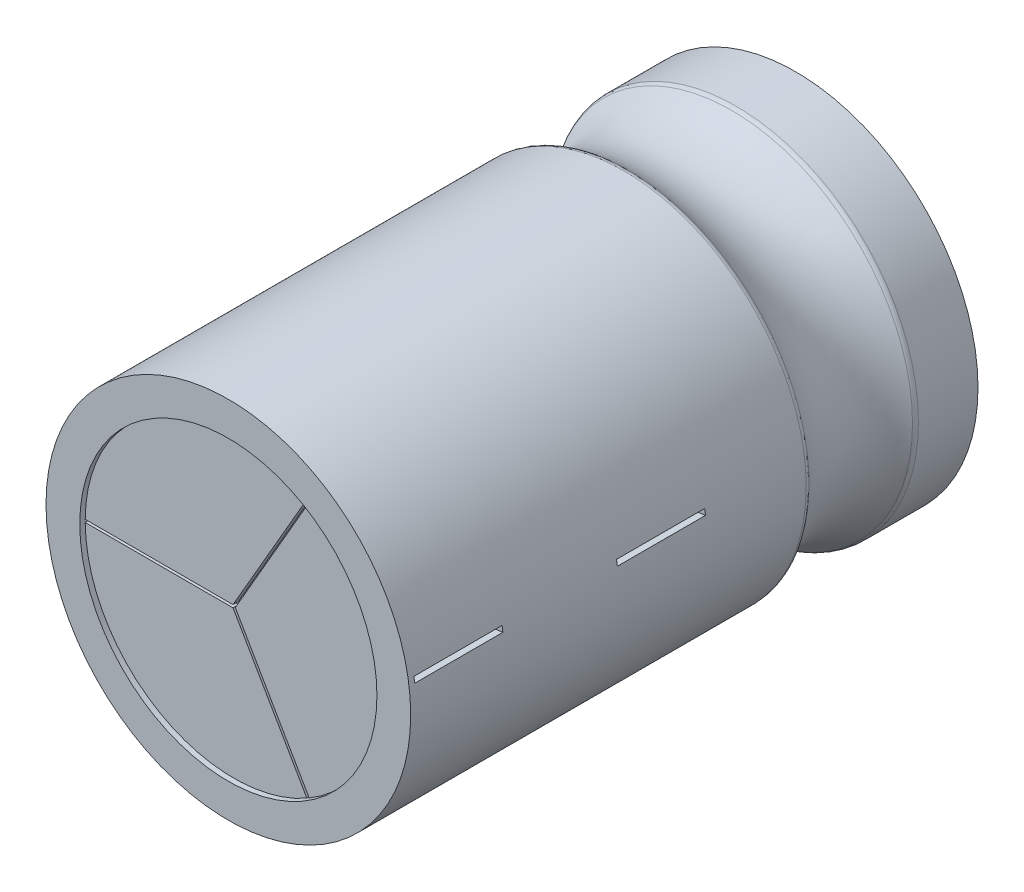
ISO-10303-21;
HEADER;
FILE_DESCRIPTION(('STEP AP214'),'2;1');
FILE_NAME('part.step','',(''),(''),'','','');
FILE_SCHEMA(('AUTOMOTIVE_DESIGN { 1 0 10303 214 1 1 1 1 }'));
ENDSEC;
DATA;
#1=APPLICATION_CONTEXT('core data for automotive mechanical design processes');
#2=APPLICATION_PROTOCOL_DEFINITION('international standard','automotive_design',2000,#1);
#3=PRODUCT_CONTEXT('',#1,'mechanical');
#4=PRODUCT('Part','Part','',(#3));
#5=PRODUCT_RELATED_PRODUCT_CATEGORY('part','',(#4));
#6=PRODUCT_DEFINITION_FORMATION('','',#4);
#7=PRODUCT_DEFINITION_CONTEXT('part definition',#1,'design');
#8=PRODUCT_DEFINITION('design','',#6,#7);
#9=PRODUCT_DEFINITION_SHAPE('','',#8);
#10=(LENGTH_UNIT() NAMED_UNIT(*) SI_UNIT(.MILLI.,.METRE.));
#11=(NAMED_UNIT(*) PLANE_ANGLE_UNIT() SI_UNIT($,.RADIAN.));
#12=(NAMED_UNIT(*) SI_UNIT($,.STERADIAN.) SOLID_ANGLE_UNIT());
#13=UNCERTAINTY_MEASURE_WITH_UNIT(LENGTH_MEASURE(1.E-05),#10,'distance_accuracy_value','');
#14=(GEOMETRIC_REPRESENTATION_CONTEXT(3) GLOBAL_UNCERTAINTY_ASSIGNED_CONTEXT((#13)) GLOBAL_UNIT_ASSIGNED_CONTEXT((#10,
#11,#12)) REPRESENTATION_CONTEXT('',''));
#15=CARTESIAN_POINT('',(0.,0.,0.));
#16=DIRECTION('',(0.,0.,1.));
#17=DIRECTION('',(1.,0.,0.));
#18=AXIS2_PLACEMENT_3D('',#15,#16,#17);
#19=CARTESIAN_POINT('',(0.,0.,0.));
#20=DIRECTION('',(0.,0.,1.));
#21=DIRECTION('',(1.,0.,0.));
#22=AXIS2_PLACEMENT_3D('',#19,#20,#21);
#23=PLANE('',#22);
#24=CARTESIAN_POINT('',(-2.53999999999999,0.,0.));
#25=DIRECTION('',(0.,0.,1.));
#26=DIRECTION('',(1.,0.,0.));
#27=AXIS2_PLACEMENT_3D('',#24,#25,#26);
#28=CIRCLE('',#27,0.6);
#29=CARTESIAN_POINT('',(-1.93999999999999,0.,0.));
#30=VERTEX_POINT('',#29);
#31=EDGE_CURVE('E96',#30,#30,#28,.F.);
#32=ORIENTED_EDGE('',*,*,#31,.F.);
#33=EDGE_LOOP('',(#32));
#34=FACE_BOUND('',#33,.T.);
#35=CARTESIAN_POINT('',(0.,0.,0.));
#36=DIRECTION('',(0.,0.,1.));
#37=DIRECTION('',(1.,0.,0.));
#38=AXIS2_PLACEMENT_3D('',#35,#36,#37);
#39=CIRCLE('',#38,6.75);
#40=CARTESIAN_POINT('',(-6.75,0.,0.));
#41=VERTEX_POINT('',#40);
#42=EDGE_CURVE('E389',#41,#41,#39,.T.);
#43=ORIENTED_EDGE('',*,*,#42,.F.);
#44=EDGE_LOOP('',(#43));
#45=FACE_BOUND('',#44,.T.);
#46=CARTESIAN_POINT('',(2.53999999999999,0.,0.));
#47=DIRECTION('',(0.,0.,1.));
#48=DIRECTION('',(1.,0.,0.));
#49=AXIS2_PLACEMENT_3D('',#46,#47,#48);
#50=CIRCLE('',#49,0.6);
#51=CARTESIAN_POINT('',(3.13999999999999,0.,0.));
#52=VERTEX_POINT('',#51);
#53=EDGE_CURVE('E13',#52,#52,#50,.F.);
#54=ORIENTED_EDGE('',*,*,#53,.F.);
#55=EDGE_LOOP('',(#54));
#56=FACE_BOUND('',#55,.T.);
#57=ADVANCED_FACE('F88',(#34,#45,#56),#23,.F.);
#58=CARTESIAN_POINT('',(0.,0.,20.8));
#59=DIRECTION('',(0.,0.,1.));
#60=DIRECTION('',(1.,0.,0.));
#61=AXIS2_PLACEMENT_3D('',#58,#59,#60);
#62=PLANE('',#61);
#63=DIRECTION('',(-1.,0.,0.));
#64=VECTOR('',#63,1.);
#65=CARTESIAN_POINT('',(0.,0.0499999999999997,20.8));
#66=LINE('',#65,#64);
#67=CARTESIAN_POINT('',(-0.0288675134594828,0.0499999999999997,20.8));
#68=VERTEX_POINT('',#67);
#69=CARTESIAN_POINT('',(-5.49977272257682,0.049999999999999,20.8));
#70=VERTEX_POINT('',#69);
#71=EDGE_CURVE('E336',#68,#70,#66,.T.);
#72=ORIENTED_EDGE('',*,*,#71,.F.);
#73=DIRECTION('',(0.500000000000004,0.866025403784436,0.));
#74=VECTOR('',#73,1.);
#75=CARTESIAN_POINT('',(-5.34399220665468,-9.15606601717793,20.8));
#76=LINE('',#75,#74);
#77=CARTESIAN_POINT('',(2.70658509109921,4.78794289279222,20.8));
#78=VERTEX_POINT('',#77);
#79=EDGE_CURVE('E301',#68,#78,#76,.T.);
#80=ORIENTED_EDGE('',*,*,#79,.T.);
#81=CARTESIAN_POINT('',(0.,0.,20.8));
#82=DIRECTION('',(0.,0.,1.));
#83=DIRECTION('',(1.,0.,0.));
#84=AXIS2_PLACEMENT_3D('',#81,#82,#83);
#85=CIRCLE('',#84,5.5);
#86=EDGE_CURVE('E392',#78,#70,#85,.T.);
#87=ORIENTED_EDGE('',*,*,#86,.T.);
#88=EDGE_LOOP('',(#72,#80,#87));
#89=FACE_BOUND('',#88,.T.);
#90=ADVANCED_FACE('F434',(#89),#62,.T.);
#91=DIRECTION('',(0.499999999999992,-0.866025403784443,0.));
#92=VECTOR('',#91,1.);
#93=CARTESIAN_POINT('',(5.25738966627616,-9.20606601717808,20.8));
#94=LINE('',#93,#92);
#95=CARTESIAN_POINT('',(-0.0288675134594838,-0.049999999999998,20.8));
#96=VERTEX_POINT('',#95);
#97=CARTESIAN_POINT('',(2.70658509109914,-4.78794289279225,20.8));
#98=VERTEX_POINT('',#97);
#99=EDGE_CURVE('E355',#96,#98,#94,.T.);
#100=ORIENTED_EDGE('',*,*,#99,.F.);
#101=DIRECTION('',(-1.,0.,0.));
#102=VECTOR('',#101,1.);
#103=CARTESIAN_POINT('',(0.,-0.0499999999999997,20.8));
#104=LINE('',#103,#102);
#105=CARTESIAN_POINT('',(-5.49977272257682,-0.049999999999999,20.8));
#106=VERTEX_POINT('',#105);
#107=EDGE_CURVE('E346',#96,#106,#104,.T.);
#108=ORIENTED_EDGE('',*,*,#107,.T.);
#109=EDGE_CURVE('E400',#106,#98,#85,.T.);
#110=ORIENTED_EDGE('',*,*,#109,.T.);
#111=EDGE_LOOP('',(#100,#108,#110));
#112=FACE_BOUND('',#111,.T.);
#113=ADVANCED_FACE('F462',(#112),#62,.T.);
#114=DIRECTION('',(0.500000000000004,0.866025403784436,0.));
#115=VECTOR('',#114,1.);
#116=CARTESIAN_POINT('',(-5.25738966627624,-9.20606601717793,20.8));
#117=LINE('',#116,#115);
#118=CARTESIAN_POINT('',(0.0577350269189624,0.,20.8));
#119=VERTEX_POINT('',#118);
#120=CARTESIAN_POINT('',(2.79318763147765,4.73794289279222,20.8));
#121=VERTEX_POINT('',#120);
#122=EDGE_CURVE('E305',#119,#121,#117,.T.);
#123=ORIENTED_EDGE('',*,*,#122,.F.);
#124=DIRECTION('',(0.499999999999992,-0.866025403784443,0.));
#125=VECTOR('',#124,1.);
#126=CARTESIAN_POINT('',(5.3439922066546,-9.15606601717808,20.8));
#127=LINE('',#126,#125);
#128=CARTESIAN_POINT('',(2.79318763147759,-4.73794289279225,20.8));
#129=VERTEX_POINT('',#128);
#130=EDGE_CURVE('E363',#119,#129,#127,.T.);
#131=ORIENTED_EDGE('',*,*,#130,.T.);
#132=EDGE_CURVE('E384',#129,#121,#85,.T.);
#133=ORIENTED_EDGE('',*,*,#132,.T.);
#134=EDGE_LOOP('',(#123,#131,#133));
#135=FACE_BOUND('',#134,.T.);
#136=ADVANCED_FACE('F410',(#135),#62,.T.);
#137=CARTESIAN_POINT('',(0.,0.,21.));
#138=DIRECTION('',(0.,0.,-1.));
#139=DIRECTION('',(-1.,0.,0.));
#140=AXIS2_PLACEMENT_3D('',#137,#138,#139);
#141=CYLINDRICAL_SURFACE('',#140,6.75);
#142=CARTESIAN_POINT('',(0.,0.,13.2916666666667));
#143=DIRECTION('',(0.,0.,-1.));
#144=DIRECTION('',(0.991341758161965,0.131306962969771,0.));
#145=AXIS2_PLACEMENT_3D('',#142,#143,#144);
#146=CIRCLE('',#145,6.75);
#147=CARTESIAN_POINT('',(6.66101866210568,1.09239662352091,13.2916666666667));
#148=VERTEX_POINT('',#147);
#149=CARTESIAN_POINT('',(6.69155686759326,0.886322000045955,13.2916666666667));
#150=VERTEX_POINT('',#149);
#151=EDGE_CURVE('E249',#148,#150,#146,.T.);
#152=ORIENTED_EDGE('',*,*,#151,.F.);
#153=DIRECTION('',(0.,0.,-1.));
#154=VECTOR('',#153,1.);
#155=CARTESIAN_POINT('',(6.66101866210568,1.09239662352091,13.2916666666667));
#156=LINE('',#155,#154);
#157=CARTESIAN_POINT('',(6.66101866210568,1.09239662352091,10.0277777777778));
#158=VERTEX_POINT('',#157);
#159=EDGE_CURVE('E103',#148,#158,#156,.T.);
#160=ORIENTED_EDGE('',*,*,#159,.T.);
#161=CARTESIAN_POINT('',(0.,0.,10.0277777777778));
#162=DIRECTION('',(0.,0.,-1.));
#163=DIRECTION('',(0.991341758161965,0.131306962969771,0.));
#164=AXIS2_PLACEMENT_3D('',#161,#162,#163);
#165=CIRCLE('',#164,6.75);
#166=CARTESIAN_POINT('',(6.69155686759326,0.886322000045955,10.0277777777778));
#167=VERTEX_POINT('',#166);
#168=EDGE_CURVE('E229',#158,#167,#165,.T.);
#169=ORIENTED_EDGE('',*,*,#168,.T.);
#170=DIRECTION('',(0.,0.,1.));
#171=VECTOR('',#170,1.);
#172=CARTESIAN_POINT('',(6.69155686759326,0.886322000045955,10.0277777777778));
#173=LINE('',#172,#171);
#174=EDGE_CURVE('E213',#167,#150,#173,.T.);
#175=ORIENTED_EDGE('',*,*,#174,.T.);
#176=EDGE_LOOP('',(#152,#160,#169,#175));
#177=FACE_BOUND('',#176,.T.);
#178=CARTESIAN_POINT('',(0.,0.,20.7916666666667));
#179=DIRECTION('',(0.,0.,-1.));
#180=DIRECTION('',(0.991341758161965,0.131306962969771,0.));
#181=AXIS2_PLACEMENT_3D('',#178,#179,#180);
#182=CIRCLE('',#181,6.75);
#183=CARTESIAN_POINT('',(6.66101866210568,1.09239662352091,20.7916666666667));
#184=VERTEX_POINT('',#183);
#185=CARTESIAN_POINT('',(6.69155686759326,0.886322000045955,20.7916666666667));
#186=VERTEX_POINT('',#185);
#187=EDGE_CURVE('E282',#184,#186,#182,.T.);
#188=ORIENTED_EDGE('',*,*,#187,.F.);
#189=DIRECTION('',(0.,0.,-1.));
#190=VECTOR('',#189,1.);
#191=CARTESIAN_POINT('',(6.66101866210568,1.09239662352091,20.7916666666667));
#192=LINE('',#191,#190);
#193=CARTESIAN_POINT('',(6.66101866210568,1.09239662352091,17.5277777777778));
#194=VERTEX_POINT('',#193);
#195=EDGE_CURVE('E111',#184,#194,#192,.T.);
#196=ORIENTED_EDGE('',*,*,#195,.T.);
#197=CARTESIAN_POINT('',(0.,0.,17.5277777777778));
#198=DIRECTION('',(0.,0.,-1.));
#199=DIRECTION('',(0.991341758161965,0.131306962969771,0.));
#200=AXIS2_PLACEMENT_3D('',#197,#198,#199);
#201=CIRCLE('',#200,6.75);
#202=CARTESIAN_POINT('',(6.69155686759326,0.886322000045955,17.5277777777778));
#203=VERTEX_POINT('',#202);
#204=EDGE_CURVE('E264',#194,#203,#201,.T.);
#205=ORIENTED_EDGE('',*,*,#204,.T.);
#206=DIRECTION('',(0.,0.,1.));
#207=VECTOR('',#206,1.);
#208=CARTESIAN_POINT('',(6.69155686759326,0.886322000045955,17.5277777777778));
#209=LINE('',#208,#207);
#210=EDGE_CURVE('E257',#203,#186,#209,.T.);
#211=ORIENTED_EDGE('',*,*,#210,.T.);
#212=EDGE_LOOP('',(#188,#196,#205,#211));
#213=FACE_BOUND('',#212,.T.);
#214=CARTESIAN_POINT('',(0.,0.,6.35993835124731));
#215=DIRECTION('',(0.,0.,-1.));
#216=DIRECTION('',(-1.,0.,0.));
#217=AXIS2_PLACEMENT_3D('',#214,#215,#216);
#218=CIRCLE('',#217,6.75);
#219=CARTESIAN_POINT('',(-6.75,0.,6.35993835124731));
#220=VERTEX_POINT('',#219);
#221=EDGE_CURVE('E372',#220,#220,#218,.F.);
#222=ORIENTED_EDGE('',*,*,#221,.T.);
#223=EDGE_LOOP('',(#222));
#224=FACE_BOUND('',#223,.T.);
#225=CARTESIAN_POINT('',(0.,0.,21.));
#226=DIRECTION('',(0.,0.,1.));
#227=DIRECTION('',(1.,0.,0.));
#228=AXIS2_PLACEMENT_3D('',#225,#226,#227);
#229=CIRCLE('',#228,6.75);
#230=CARTESIAN_POINT('',(6.75,0.,21.));
#231=VERTEX_POINT('',#230);
#232=EDGE_CURVE('E386',#231,#231,#229,.T.);
#233=ORIENTED_EDGE('',*,*,#232,.F.);
#234=EDGE_LOOP('',(#233));
#235=FACE_BOUND('',#234,.T.);
#236=ADVANCED_FACE('F470',(#177,#213,#224,#235),#141,.T.);
#237=CARTESIAN_POINT('',(0.,0.,21.));
#238=DIRECTION('',(0.,0.,1.));
#239=DIRECTION('',(1.,0.,0.));
#240=AXIS2_PLACEMENT_3D('',#237,#238,#239);
#241=PLANE('',#240);
#242=CARTESIAN_POINT('',(0.,0.,21.));
#243=DIRECTION('',(0.,0.,1.));
#244=DIRECTION('',(1.,0.,0.));
#245=AXIS2_PLACEMENT_3D('',#242,#243,#244);
#246=CIRCLE('',#245,5.5);
#247=CARTESIAN_POINT('',(5.5,0.,21.));
#248=VERTEX_POINT('',#247);
#249=EDGE_CURVE('E381',#248,#248,#246,.T.);
#250=ORIENTED_EDGE('',*,*,#249,.F.);
#251=EDGE_LOOP('',(#250));
#252=FACE_BOUND('',#251,.T.);
#253=ORIENTED_EDGE('',*,*,#232,.T.);
#254=EDGE_LOOP('',(#253));
#255=FACE_BOUND('',#254,.T.);
#256=ADVANCED_FACE('F468',(#252,#255),#241,.T.);
#257=CARTESIAN_POINT('',(0.,0.,20.8));
#258=DIRECTION('',(0.,0.,1.));
#259=DIRECTION('',(1.,0.,0.));
#260=AXIS2_PLACEMENT_3D('',#257,#258,#259);
#261=CYLINDRICAL_SURFACE('',#260,5.5);
#262=ORIENTED_EDGE('',*,*,#86,.F.);
#263=DIRECTION('',(0.,0.,1.));
#264=VECTOR('',#263,1.);
#265=CARTESIAN_POINT('',(2.70658509109921,4.78794289279222,20.6));
#266=LINE('',#265,#264);
#267=CARTESIAN_POINT('',(2.70658509109921,4.78794289279222,20.6));
#268=VERTEX_POINT('',#267);
#269=EDGE_CURVE('E385',#268,#78,#266,.T.);
#270=ORIENTED_EDGE('',*,*,#269,.F.);
#271=CARTESIAN_POINT('',(0.,0.,20.6));
#272=DIRECTION('',(0.,0.,1.));
#273=DIRECTION('',(1.,0.,0.));
#274=AXIS2_PLACEMENT_3D('',#271,#272,#273);
#275=CIRCLE('',#274,5.5);
#276=CARTESIAN_POINT('',(2.79318763147765,4.73794289279222,20.6));
#277=VERTEX_POINT('',#276);
#278=EDGE_CURVE('E324',#277,#268,#275,.T.);
#279=ORIENTED_EDGE('',*,*,#278,.F.);
#280=DIRECTION('',(0.,0.,1.));
#281=VECTOR('',#280,1.);
#282=CARTESIAN_POINT('',(2.79318763147765,4.73794289279222,20.6));
#283=LINE('',#282,#281);
#284=EDGE_CURVE('E378',#277,#121,#283,.T.);
#285=ORIENTED_EDGE('',*,*,#284,.T.);
#286=ORIENTED_EDGE('',*,*,#132,.F.);
#287=DIRECTION('',(0.,0.,1.));
#288=VECTOR('',#287,1.);
#289=CARTESIAN_POINT('',(2.79318763147759,-4.73794289279225,20.6));
#290=LINE('',#289,#288);
#291=CARTESIAN_POINT('',(2.79318763147759,-4.73794289279225,20.6));
#292=VERTEX_POINT('',#291);
#293=EDGE_CURVE('E358',#292,#129,#290,.T.);
#294=ORIENTED_EDGE('',*,*,#293,.F.);
#295=CARTESIAN_POINT('',(0.,0.,20.6));
#296=DIRECTION('',(0.,0.,1.));
#297=DIRECTION('',(1.,0.,0.));
#298=AXIS2_PLACEMENT_3D('',#295,#296,#297);
#299=CIRCLE('',#298,5.5);
#300=CARTESIAN_POINT('',(2.70658509109914,-4.78794289279225,20.6));
#301=VERTEX_POINT('',#300);
#302=EDGE_CURVE('E316',#301,#292,#299,.T.);
#303=ORIENTED_EDGE('',*,*,#302,.F.);
#304=DIRECTION('',(0.,0.,1.));
#305=VECTOR('',#304,1.);
#306=CARTESIAN_POINT('',(2.70658509109914,-4.78794289279225,20.6));
#307=LINE('',#306,#305);
#308=EDGE_CURVE('E356',#301,#98,#307,.T.);
#309=ORIENTED_EDGE('',*,*,#308,.T.);
#310=ORIENTED_EDGE('',*,*,#109,.F.);
#311=DIRECTION('',(0.,0.,1.));
#312=VECTOR('',#311,1.);
#313=CARTESIAN_POINT('',(-5.49977272257682,-0.049999999999999,20.6));
#314=LINE('',#313,#312);
#315=CARTESIAN_POINT('',(-5.49977272257682,-0.049999999999999,20.6));
#316=VERTEX_POINT('',#315);
#317=EDGE_CURVE('E341',#316,#106,#314,.T.);
#318=ORIENTED_EDGE('',*,*,#317,.F.);
#319=CARTESIAN_POINT('',(0.,0.,20.6));
#320=DIRECTION('',(0.,0.,1.));
#321=DIRECTION('',(1.,0.,0.));
#322=AXIS2_PLACEMENT_3D('',#319,#320,#321);
#323=CIRCLE('',#322,5.5);
#324=CARTESIAN_POINT('',(-5.49977272257682,0.049999999999999,20.6));
#325=VERTEX_POINT('',#324);
#326=EDGE_CURVE('E308',#325,#316,#323,.T.);
#327=ORIENTED_EDGE('',*,*,#326,.F.);
#328=DIRECTION('',(0.,0.,1.));
#329=VECTOR('',#328,1.);
#330=CARTESIAN_POINT('',(-5.49977272257682,0.049999999999999,20.6));
#331=LINE('',#330,#329);
#332=EDGE_CURVE('E339',#325,#70,#331,.T.);
#333=ORIENTED_EDGE('',*,*,#332,.T.);
#334=EDGE_LOOP('',(#262,#270,#279,#285,#286,#294,#303,#309,#310,#318,#327,#333));
#335=FACE_BOUND('',#334,.T.);
#336=ORIENTED_EDGE('',*,*,#249,.T.);
#337=EDGE_LOOP('',(#336));
#338=FACE_BOUND('',#337,.T.);
#339=ADVANCED_FACE('F415',(#335,#338),#261,.F.);
#340=CARTESIAN_POINT('',(-5.34399220665468,-9.15606601717793,20.6));
#341=DIRECTION('',(0.866025403784436,-0.500000000000004,0.));
#342=DIRECTION('',(0.500000000000004,0.866025403784436,0.));
#343=AXIS2_PLACEMENT_3D('',#340,#341,#342);
#344=PLANE('',#343);
#345=ORIENTED_EDGE('',*,*,#79,.F.);
#346=DIRECTION('',(0.,0.,1.));
#347=VECTOR('',#346,1.);
#348=CARTESIAN_POINT('',(-0.0288675134594828,0.0499999999999997,20.6));
#349=LINE('',#348,#347);
#350=CARTESIAN_POINT('',(-0.0288675134594828,0.0499999999999997,20.6));
#351=VERTEX_POINT('',#350);
#352=EDGE_CURVE('E327',#351,#68,#349,.T.);
#353=ORIENTED_EDGE('',*,*,#352,.F.);
#354=DIRECTION('',(0.500000000000004,0.866025403784436,0.));
#355=VECTOR('',#354,1.);
#356=CARTESIAN_POINT('',(-5.34399220665468,-9.15606601717793,20.6));
#357=LINE('',#356,#355);
#358=EDGE_CURVE('E302',#351,#268,#357,.T.);
#359=ORIENTED_EDGE('',*,*,#358,.T.);
#360=ORIENTED_EDGE('',*,*,#269,.T.);
#361=EDGE_LOOP('',(#345,#353,#359,#360));
#362=FACE_BOUND('',#361,.T.);
#363=ADVANCED_FACE('F430',(#362),#344,.T.);
#364=CARTESIAN_POINT('',(-5.25738966627624,-9.20606601717793,20.6));
#365=DIRECTION('',(0.866025403784436,-0.500000000000004,0.));
#366=DIRECTION('',(0.500000000000004,0.866025403784436,0.));
#367=AXIS2_PLACEMENT_3D('',#364,#365,#366);
#368=PLANE('',#367);
#369=ORIENTED_EDGE('',*,*,#122,.T.);
#370=ORIENTED_EDGE('',*,*,#284,.F.);
#371=DIRECTION('',(0.500000000000004,0.866025403784436,0.));
#372=VECTOR('',#371,1.);
#373=CARTESIAN_POINT('',(-5.25738966627624,-9.20606601717793,20.6));
#374=LINE('',#373,#372);
#375=CARTESIAN_POINT('',(0.0577350269189624,0.,20.6));
#376=VERTEX_POINT('',#375);
#377=EDGE_CURVE('E321',#376,#277,#374,.T.);
#378=ORIENTED_EDGE('',*,*,#377,.F.);
#379=DIRECTION('',(0.,0.,1.));
#380=VECTOR('',#379,1.);
#381=CARTESIAN_POINT('',(0.0577350269189624,0.,20.6));
#382=LINE('',#381,#380);
#383=EDGE_CURVE('E367',#376,#119,#382,.T.);
#384=ORIENTED_EDGE('',*,*,#383,.T.);
#385=EDGE_LOOP('',(#369,#370,#378,#384));
#386=FACE_BOUND('',#385,.T.);
#387=ADVANCED_FACE('F422',(#386),#368,.F.);
#388=CARTESIAN_POINT('',(5.3439922066546,-9.15606601717808,20.6));
#389=DIRECTION('',(-0.866025403784443,-0.499999999999992,0.));
#390=DIRECTION('',(0.499999999999992,-0.866025403784443,0.));
#391=AXIS2_PLACEMENT_3D('',#388,#389,#390);
#392=PLANE('',#391);
#393=ORIENTED_EDGE('',*,*,#130,.F.);
#394=ORIENTED_EDGE('',*,*,#383,.F.);
#395=DIRECTION('',(0.499999999999992,-0.866025403784443,0.));
#396=VECTOR('',#395,1.);
#397=CARTESIAN_POINT('',(5.3439922066546,-9.15606601717808,20.6));
#398=LINE('',#397,#396);
#399=EDGE_CURVE('E319',#376,#292,#398,.T.);
#400=ORIENTED_EDGE('',*,*,#399,.T.);
#401=ORIENTED_EDGE('',*,*,#293,.T.);
#402=EDGE_LOOP('',(#393,#394,#400,#401));
#403=FACE_BOUND('',#402,.T.);
#404=ADVANCED_FACE('F444',(#403),#392,.T.);
#405=CARTESIAN_POINT('',(5.25738966627616,-9.20606601717808,20.6));
#406=DIRECTION('',(-0.866025403784443,-0.499999999999992,0.));
#407=DIRECTION('',(0.499999999999992,-0.866025403784443,0.));
#408=AXIS2_PLACEMENT_3D('',#405,#406,#407);
#409=PLANE('',#408);
#410=ORIENTED_EDGE('',*,*,#99,.T.);
#411=ORIENTED_EDGE('',*,*,#308,.F.);
#412=DIRECTION('',(0.499999999999992,-0.866025403784443,0.));
#413=VECTOR('',#412,1.);
#414=CARTESIAN_POINT('',(5.25738966627616,-9.20606601717808,20.6));
#415=LINE('',#414,#413);
#416=CARTESIAN_POINT('',(-0.0288675134594838,-0.049999999999998,20.6));
#417=VERTEX_POINT('',#416);
#418=EDGE_CURVE('E313',#417,#301,#415,.T.);
#419=ORIENTED_EDGE('',*,*,#418,.F.);
#420=DIRECTION('',(0.,0.,1.));
#421=VECTOR('',#420,1.);
#422=CARTESIAN_POINT('',(-0.0288675134594838,-0.049999999999998,20.6));
#423=LINE('',#422,#421);
#424=EDGE_CURVE('E350',#417,#96,#423,.T.);
#425=ORIENTED_EDGE('',*,*,#424,.T.);
#426=EDGE_LOOP('',(#410,#411,#419,#425));
#427=FACE_BOUND('',#426,.T.);
#428=ADVANCED_FACE('F446',(#427),#409,.F.);
#429=CARTESIAN_POINT('',(0.,-0.0499999999999997,20.6));
#430=DIRECTION('',(0.,1.,0.));
#431=DIRECTION('',(-1.,0.,0.));
#432=AXIS2_PLACEMENT_3D('',#429,#430,#431);
#433=PLANE('',#432);
#434=ORIENTED_EDGE('',*,*,#107,.F.);
#435=ORIENTED_EDGE('',*,*,#424,.F.);
#436=DIRECTION('',(-1.,0.,0.));
#437=VECTOR('',#436,1.);
#438=CARTESIAN_POINT('',(0.,-0.0499999999999997,20.6));
#439=LINE('',#438,#437);
#440=EDGE_CURVE('E311',#417,#316,#439,.T.);
#441=ORIENTED_EDGE('',*,*,#440,.T.);
#442=ORIENTED_EDGE('',*,*,#317,.T.);
#443=EDGE_LOOP('',(#434,#435,#441,#442));
#444=FACE_BOUND('',#443,.T.);
#445=ADVANCED_FACE('F452',(#444),#433,.T.);
#446=CARTESIAN_POINT('',(0.,0.0499999999999997,20.6));
#447=DIRECTION('',(0.,1.,0.));
#448=DIRECTION('',(-1.,0.,0.));
#449=AXIS2_PLACEMENT_3D('',#446,#447,#448);
#450=PLANE('',#449);
#451=ORIENTED_EDGE('',*,*,#71,.T.);
#452=ORIENTED_EDGE('',*,*,#332,.F.);
#453=DIRECTION('',(-1.,0.,0.));
#454=VECTOR('',#453,1.);
#455=CARTESIAN_POINT('',(0.,0.0499999999999997,20.6));
#456=LINE('',#455,#454);
#457=EDGE_CURVE('E304',#351,#325,#456,.T.);
#458=ORIENTED_EDGE('',*,*,#457,.F.);
#459=ORIENTED_EDGE('',*,*,#352,.T.);
#460=EDGE_LOOP('',(#451,#452,#458,#459));
#461=FACE_BOUND('',#460,.T.);
#462=ADVANCED_FACE('F439',(#461),#450,.F.);
#463=CARTESIAN_POINT('',(0.,-12.2414213562373,20.6));
#464=DIRECTION('',(0.,0.,1.));
#465=DIRECTION('',(1.,0.,0.));
#466=AXIS2_PLACEMENT_3D('',#463,#464,#465);
#467=PLANE('',#466);
#468=ORIENTED_EDGE('',*,*,#358,.F.);
#469=ORIENTED_EDGE('',*,*,#457,.T.);
#470=ORIENTED_EDGE('',*,*,#326,.T.);
#471=ORIENTED_EDGE('',*,*,#440,.F.);
#472=ORIENTED_EDGE('',*,*,#418,.T.);
#473=ORIENTED_EDGE('',*,*,#302,.T.);
#474=ORIENTED_EDGE('',*,*,#399,.F.);
#475=ORIENTED_EDGE('',*,*,#377,.T.);
#476=ORIENTED_EDGE('',*,*,#278,.T.);
#477=EDGE_LOOP('',(#468,#469,#470,#471,#472,#473,#474,#475,#476));
#478=FACE_BOUND('',#477,.T.);
#479=ADVANCED_FACE('F441',(#478),#467,.T.);
#480=CARTESIAN_POINT('',(0.,0.,4.28328238551779));
#481=DIRECTION('',(0.,0.,-1.));
#482=DIRECTION('',(-1.,0.,0.));
#483=AXIS2_PLACEMENT_3D('',#480,#481,#482);
#484=TOROIDAL_SURFACE('',#483,9.,3.);
#485=CARTESIAN_POINT('',(0.,0.,6.20019558465273));
#486=DIRECTION('',(0.,0.,-1.));
#487=DIRECTION('',(-1.,0.,0.));
#488=AXIS2_PLACEMENT_3D('',#485,#486,#487);
#489=CIRCLE('',#488,6.69230769230769);
#490=CARTESIAN_POINT('',(-6.69230769230769,0.,6.20019558465273));
#491=VERTEX_POINT('',#490);
#492=EDGE_CURVE('E488',#491,#491,#489,.T.);
#493=ORIENTED_EDGE('',*,*,#492,.T.);
#494=EDGE_LOOP('',(#493));
#495=FACE_BOUND('',#494,.T.);
#496=CARTESIAN_POINT('',(0.,0.,2.36636918638285));
#497=DIRECTION('',(0.,0.,1.));
#498=DIRECTION('',(1.,0.,0.));
#499=AXIS2_PLACEMENT_3D('',#496,#497,#498);
#500=CIRCLE('',#499,6.69230769230769);
#501=CARTESIAN_POINT('',(6.69230769230769,0.,2.36636918638285));
#502=VERTEX_POINT('',#501);
#503=EDGE_CURVE('E492',#502,#502,#500,.T.);
#504=ORIENTED_EDGE('',*,*,#503,.T.);
#505=EDGE_LOOP('',(#504));
#506=FACE_BOUND('',#505,.T.);
#507=ADVANCED_FACE('F483',(#495,#506),#484,.F.);
#508=CARTESIAN_POINT('',(0.,0.,2.20662641978827));
#509=DIRECTION('',(0.,0.,1.));
#510=DIRECTION('',(1.,0.,0.));
#511=AXIS2_PLACEMENT_3D('',#508,#509,#510);
#512=CIRCLE('',#511,6.75);
#513=CARTESIAN_POINT('',(-6.75,0.,2.20662641978827));
#514=VERTEX_POINT('',#513);
#515=EDGE_CURVE('E496',#514,#514,#512,.F.);
#516=CARTESIAN_POINT('',(-6.75,0.,2.20662641978827));
#517=CARTESIAN_POINT('',(-6.75,0.,2.18364072791548));
#518=CARTESIAN_POINT('',(-6.75,0.,2.16065503604268));
#519=CARTESIAN_POINT('',(-6.75,0.,2.11468365229709));
#520=CARTESIAN_POINT('',(-6.75,0.,2.0916979604243));
#521=CARTESIAN_POINT('',(-6.75,0.,2.04572657667871));
#522=CARTESIAN_POINT('',(-6.75,0.,2.02274088480591));
#523=CARTESIAN_POINT('',(-6.75,0.,1.97676950106033));
#524=CARTESIAN_POINT('',(-6.75,0.,1.95378380918753));
#525=CARTESIAN_POINT('',(-6.75,0.,1.90781242544194));
#526=CARTESIAN_POINT('',(-6.75,0.,1.88482673356915));
#527=CARTESIAN_POINT('',(-6.75,0.,1.83885534982356));
#528=CARTESIAN_POINT('',(-6.75,0.,1.81586965795076));
#529=CARTESIAN_POINT('',(-6.75,0.,1.76989827420517));
#530=CARTESIAN_POINT('',(-6.75,0.,1.74691258233238));
#531=CARTESIAN_POINT('',(-6.75,0.,1.70094119858679));
#532=CARTESIAN_POINT('',(-6.75,0.,1.677955506714));
#533=CARTESIAN_POINT('',(-6.75,0.,1.63198412296841));
#534=CARTESIAN_POINT('',(-6.75,0.,1.60899843109561));
#535=CARTESIAN_POINT('',(-6.75,0.,1.56302704735002));
#536=CARTESIAN_POINT('',(-6.75,0.,1.54004135547723));
#537=CARTESIAN_POINT('',(-6.75,0.,1.49406997173164));
#538=CARTESIAN_POINT('',(-6.75,0.,1.47108427985885));
#539=CARTESIAN_POINT('',(-6.75,0.,1.42511289611326));
#540=CARTESIAN_POINT('',(-6.75,0.,1.40212720424046));
#541=CARTESIAN_POINT('',(-6.75,0.,1.35615582049487));
#542=CARTESIAN_POINT('',(-6.75,0.,1.33317012862208));
#543=CARTESIAN_POINT('',(-6.75,0.,1.28719874487649));
#544=CARTESIAN_POINT('',(-6.75,0.,1.2642130530037));
#545=CARTESIAN_POINT('',(-6.75,0.,1.21824166925811));
#546=CARTESIAN_POINT('',(-6.75,0.,1.19525597738531));
#547=CARTESIAN_POINT('',(-6.75,0.,1.14928459363972));
#548=CARTESIAN_POINT('',(-6.75,0.,1.12629890176693));
#549=CARTESIAN_POINT('',(-6.75,0.,1.08032751802134));
#550=CARTESIAN_POINT('',(-6.75,0.,1.05734182614855));
#551=CARTESIAN_POINT('',(-6.75,0.,1.01137044240296));
#552=CARTESIAN_POINT('',(-6.75,0.,0.988384750530163));
#553=CARTESIAN_POINT('',(-6.75,0.,0.942413366784575));
#554=CARTESIAN_POINT('',(-6.75,0.,0.91942767491178));
#555=CARTESIAN_POINT('',(-6.75,0.,0.87345629116619));
#556=CARTESIAN_POINT('',(-6.75,0.,0.850470599293395));
#557=CARTESIAN_POINT('',(-6.75,0.,0.804499215547807));
#558=CARTESIAN_POINT('',(-6.75,0.,0.781513523675013));
#559=CARTESIAN_POINT('',(-6.75,0.,0.735542139929424));
#560=CARTESIAN_POINT('',(-6.75,0.,0.71255644805663));
#561=CARTESIAN_POINT('',(-6.75,0.,0.66658506431104));
#562=CARTESIAN_POINT('',(-6.75,0.,0.643599372438245));
#563=CARTESIAN_POINT('',(-6.75,0.,0.597627988692657));
#564=CARTESIAN_POINT('',(-6.75,0.,0.574642296819863));
#565=CARTESIAN_POINT('',(-6.75,0.,0.528670913074274));
#566=CARTESIAN_POINT('',(-6.75,0.,0.50568522120148));
#567=CARTESIAN_POINT('',(-6.75,0.,0.45971383745589));
#568=CARTESIAN_POINT('',(-6.75,0.,0.436728145583095));
#569=CARTESIAN_POINT('',(-6.75,0.,0.390756761837505));
#570=CARTESIAN_POINT('',(-6.75,0.,0.36777106996471));
#571=CARTESIAN_POINT('',(-6.75,0.,0.321799686219122));
#572=CARTESIAN_POINT('',(-6.75,0.,0.298813994346328));
#573=CARTESIAN_POINT('',(-6.75,0.,0.25284261060074));
#574=CARTESIAN_POINT('',(-6.75,0.,0.229856918727945));
#575=CARTESIAN_POINT('',(-6.75,0.,0.183885534982355));
#576=CARTESIAN_POINT('',(-6.75,0.,0.16089984310956));
#577=CARTESIAN_POINT('',(-6.75,0.,0.114928459363972));
#578=CARTESIAN_POINT('',(-6.75,0.,0.0919427674911782));
#579=CARTESIAN_POINT('',(-6.75,0.,0.0459713837455897));
#580=CARTESIAN_POINT('',(-6.75,0.,0.0229856918727949));
#581=CARTESIAN_POINT('',(-6.75,0.,0.));
#582=B_SPLINE_CURVE_WITH_KNOTS('',3,(#516,#517,#518,#519,#520,#521,#522,#523,#524,#525,#526,
#527,#528,#529,#530,#531,#532,#533,#534,#535,#536,#537,#538,#539,#540,#541,#542,#543,#544,#545,
#546,#547,#548,#549,#550,#551,#552,#553,#554,#555,#556,#557,#558,#559,#560,#561,#562,#563,#564,
#565,#566,#567,#568,#569,#570,#571,#572,#573,#574,#575,#576,#577,#578,#579,#580,#581),
.UNSPECIFIED.,.F.,.F.,(4,2,2,2,2,2,2,2,2,2,2,2,2,2,2,2,2,2,2,2,2,2,2,2,2,2,2,2,2,2,2,2,4),(0.,
0.0689570756183845,0.137914151236766,0.20687122685515,0.275828302473535,0.344785378091916,
0.4137424537103,0.482699529328685,0.551656604947069,0.62061368056545,0.689570756183835,
0.758527831802219,0.8274849074206,0.896441983038985,0.965399058657369,1.03435613427575,
1.10331320989413,1.17227028551252,1.2412273611309,1.31018443674928,1.37914151236767,
1.44809858798605,1.51705566360444,1.58601273922282,1.6549698148412,1.72392689045959,
1.79288396607797,1.86184104169635,1.93079811731474,1.99975519293312,2.0687122685515,
2.13766934416989,2.20662641978827),.UNSPECIFIED.);
#583=EDGE_CURVE('BSEAM473',#514,#41,#582,.T.);
#584=ORIENTED_EDGE('',*,*,#515,.T.);
#585=ORIENTED_EDGE('',*,*,#42,.T.);
#586=ORIENTED_EDGE('',*,*,#583,.T.);
#587=ORIENTED_EDGE('',*,*,#583,.F.);
#588=EDGE_LOOP('',(#584,#586,#585,#587));
#589=FACE_BOUND('',#588,.T.);
#590=ADVANCED_FACE('F473',(#589),#141,.T.);
#591=CARTESIAN_POINT('',(0.,0.,6.35993835124731));
#592=DIRECTION('',(0.,0.,-1.));
#593=DIRECTION('',(-1.,0.,0.));
#594=AXIS2_PLACEMENT_3D('',#591,#592,#593);
#595=TOROIDAL_SURFACE('',#594,6.5,0.25);
#596=ORIENTED_EDGE('',*,*,#492,.F.);
#597=EDGE_LOOP('',(#596));
#598=FACE_BOUND('',#597,.T.);
#599=ORIENTED_EDGE('',*,*,#221,.F.);
#600=EDGE_LOOP('',(#599));
#601=FACE_BOUND('',#600,.T.);
#602=ADVANCED_FACE('F474',(#598,#601),#595,.T.);
#603=CARTESIAN_POINT('',(0.,0.,2.20662641978827));
#604=DIRECTION('',(0.,0.,1.));
#605=DIRECTION('',(1.,0.,0.));
#606=AXIS2_PLACEMENT_3D('',#603,#604,#605);
#607=TOROIDAL_SURFACE('',#606,6.5,0.25);
#608=ORIENTED_EDGE('',*,*,#503,.F.);
#609=EDGE_LOOP('',(#608));
#610=FACE_BOUND('',#609,.T.);
#611=ORIENTED_EDGE('',*,*,#515,.F.);
#612=EDGE_LOOP('',(#611));
#613=FACE_BOUND('',#612,.T.);
#614=ADVANCED_FACE('F90',(#610,#613),#607,.T.);
#615=CARTESIAN_POINT('',(-2.53999999999999,0.,-2.));
#616=DIRECTION('',(0.,0.,1.));
#617=DIRECTION('',(1.,0.,0.));
#618=AXIS2_PLACEMENT_3D('',#615,#616,#617);
#619=CYLINDRICAL_SURFACE('',#618,0.6);
#620=CARTESIAN_POINT('',(-2.53999999999999,0.,-2.));
#621=DIRECTION('',(0.,0.,-1.));
#622=DIRECTION('',(-1.,0.,0.));
#623=AXIS2_PLACEMENT_3D('',#620,#621,#622);
#624=CIRCLE('',#623,0.6);
#625=CARTESIAN_POINT('',(-3.13999999999999,0.,-2.));
#626=VERTEX_POINT('',#625);
#627=EDGE_CURVE('E298',#626,#626,#624,.T.);
#628=ORIENTED_EDGE('',*,*,#627,.F.);
#629=EDGE_LOOP('',(#628));
#630=FACE_BOUND('',#629,.T.);
#631=ORIENTED_EDGE('',*,*,#31,.T.);
#632=EDGE_LOOP('',(#631));
#633=FACE_BOUND('',#632,.T.);
#634=ADVANCED_FACE('F481',(#630,#633),#619,.T.);
#635=CARTESIAN_POINT('',(-2.53999999999999,0.,-2.));
#636=DIRECTION('',(0.,0.,-1.));
#637=DIRECTION('',(-1.,0.,0.));
#638=AXIS2_PLACEMENT_3D('',#635,#636,#637);
#639=PLANE('',#638);
#640=ORIENTED_EDGE('',*,*,#627,.T.);
#641=EDGE_LOOP('',(#640));
#642=FACE_BOUND('',#641,.T.);
#643=ADVANCED_FACE('F503',(#642),#639,.T.);
#644=CARTESIAN_POINT('',(2.53999999999999,0.,-2.));
#645=DIRECTION('',(0.,0.,1.));
#646=DIRECTION('',(1.,0.,0.));
#647=AXIS2_PLACEMENT_3D('',#644,#645,#646);
#648=CYLINDRICAL_SURFACE('',#647,0.6);
#649=CARTESIAN_POINT('',(2.53999999999999,0.,-2.));
#650=DIRECTION('',(0.,0.,-1.));
#651=DIRECTION('',(1.,0.,0.));
#652=AXIS2_PLACEMENT_3D('',#649,#650,#651);
#653=CIRCLE('',#652,0.6);
#654=CARTESIAN_POINT('',(3.13999999999999,0.,-2.));
#655=VERTEX_POINT('',#654);
#656=EDGE_CURVE('E294',#655,#655,#653,.T.);
#657=ORIENTED_EDGE('',*,*,#656,.F.);
#658=EDGE_LOOP('',(#657));
#659=FACE_BOUND('',#658,.T.);
#660=ORIENTED_EDGE('',*,*,#53,.T.);
#661=EDGE_LOOP('',(#660));
#662=FACE_BOUND('',#661,.T.);
#663=ADVANCED_FACE('F509',(#659,#662),#648,.T.);
#664=CARTESIAN_POINT('',(2.53999999999999,0.,-2.));
#665=DIRECTION('',(0.,0.,1.));
#666=DIRECTION('',(1.,0.,0.));
#667=AXIS2_PLACEMENT_3D('',#664,#665,#666);
#668=PLANE('',#667);
#669=ORIENTED_EDGE('',*,*,#656,.T.);
#670=EDGE_LOOP('',(#669));
#671=FACE_BOUND('',#670,.T.);
#672=ADVANCED_FACE('F670',(#671),#668,.F.);
#673=CARTESIAN_POINT('',(6.66101866210568,1.09239662352091,19.1597222222222));
#674=DIRECTION('',(0.161836536817912,-0.986817579571212,0.));
#675=DIRECTION('',(0.,0.,-1.));
#676=AXIS2_PLACEMENT_3D('',#673,#674,#675);
#677=PLANE('',#676);
#678=DIRECTION('',(-0.986817579571212,-0.161836536817912,0.));
#679=VECTOR('',#678,1.);
#680=CARTESIAN_POINT('',(6.66101866210568,1.09239662352091,20.7916666666667));
#681=LINE('',#680,#679);
#682=CARTESIAN_POINT('',(5.67420108253447,0.930560086702992,20.7916666666667));
#683=VERTEX_POINT('',#682);
#684=EDGE_CURVE('E292',#184,#683,#681,.T.);
#685=ORIENTED_EDGE('',*,*,#684,.T.);
#686=DIRECTION('',(0.,0.,-1.));
#687=VECTOR('',#686,1.);
#688=CARTESIAN_POINT('',(5.67420108253447,0.930560086702992,21.));
#689=LINE('',#688,#687);
#690=CARTESIAN_POINT('',(5.67420108253447,0.930560086702995,17.5277777777778));
#691=VERTEX_POINT('',#690);
#692=EDGE_CURVE('E270',#683,#691,#689,.T.);
#693=ORIENTED_EDGE('',*,*,#692,.T.);
#694=DIRECTION('',(-0.986817579571212,-0.161836536817912,0.));
#695=VECTOR('',#694,1.);
#696=CARTESIAN_POINT('',(6.66101866210568,1.09239662352091,17.5277777777778));
#697=LINE('',#696,#695);
#698=EDGE_CURVE('E290',#194,#691,#697,.T.);
#699=ORIENTED_EDGE('',*,*,#698,.F.);
#700=ORIENTED_EDGE('',*,*,#195,.F.);
#701=EDGE_LOOP('',(#685,#693,#699,#700));
#702=FACE_BOUND('',#701,.T.);
#703=ADVANCED_FACE('F678',(#702),#677,.T.);
#704=CARTESIAN_POINT('',(0.,0.,17.5277777777778));
#705=DIRECTION('',(0.,0.,1.));
#706=DIRECTION('',(1.,0.,0.));
#707=AXIS2_PLACEMENT_3D('',#704,#705,#706);
#708=PLANE('',#707);
#709=ORIENTED_EDGE('',*,*,#698,.T.);
#710=CARTESIAN_POINT('',(0.,0.,17.5277777777778));
#711=DIRECTION('',(0.,0.,-1.));
#712=DIRECTION('',(-1.,0.,0.));
#713=AXIS2_PLACEMENT_3D('',#710,#711,#712);
#714=CIRCLE('',#713,5.75);
#715=CARTESIAN_POINT('',(5.7002151094313,0.755015037076182,17.5277777777778));
#716=VERTEX_POINT('',#715);
#717=EDGE_CURVE('E265',#691,#716,#714,.T.);
#718=ORIENTED_EDGE('',*,*,#717,.T.);
#719=DIRECTION('',(-0.991341758161965,-0.131306962969771,0.));
#720=VECTOR('',#719,1.);
#721=CARTESIAN_POINT('',(6.69155686759326,0.886322000045955,17.5277777777778));
#722=LINE('',#721,#720);
#723=EDGE_CURVE('E288',#203,#716,#722,.T.);
#724=ORIENTED_EDGE('',*,*,#723,.F.);
#725=ORIENTED_EDGE('',*,*,#204,.F.);
#726=EDGE_LOOP('',(#709,#718,#724,#725));
#727=FACE_BOUND('',#726,.T.);
#728=ADVANCED_FACE('F687',(#727),#708,.T.);
#729=CARTESIAN_POINT('',(6.69155686759326,0.886322000045955,19.1597222222222));
#730=DIRECTION('',(-0.131306962969771,0.991341758161965,0.));
#731=DIRECTION('',(0.,0.,1.));
#732=AXIS2_PLACEMENT_3D('',#729,#730,#731);
#733=PLANE('',#732);
#734=ORIENTED_EDGE('',*,*,#723,.T.);
#735=DIRECTION('',(0.,0.,-1.));
#736=VECTOR('',#735,1.);
#737=CARTESIAN_POINT('',(5.7002151094313,0.755015037076182,21.));
#738=LINE('',#737,#736);
#739=CARTESIAN_POINT('',(5.7002151094313,0.755015037076182,20.7916666666667));
#740=VERTEX_POINT('',#739);
#741=EDGE_CURVE('E259',#716,#740,#738,.F.);
#742=ORIENTED_EDGE('',*,*,#741,.T.);
#743=DIRECTION('',(-0.991341758161965,-0.131306962969771,0.));
#744=VECTOR('',#743,1.);
#745=CARTESIAN_POINT('',(6.69155686759326,0.886322000045955,20.7916666666667));
#746=LINE('',#745,#744);
#747=EDGE_CURVE('E269',#186,#740,#746,.T.);
#748=ORIENTED_EDGE('',*,*,#747,.F.);
#749=ORIENTED_EDGE('',*,*,#210,.F.);
#750=EDGE_LOOP('',(#734,#742,#748,#749));
#751=FACE_BOUND('',#750,.T.);
#752=ADVANCED_FACE('F695',(#751),#733,.T.);
#753=CARTESIAN_POINT('',(0.,0.,20.7916666666667));
#754=DIRECTION('',(0.,0.,1.));
#755=DIRECTION('',(1.,0.,0.));
#756=AXIS2_PLACEMENT_3D('',#753,#754,#755);
#757=PLANE('',#756);
#758=ORIENTED_EDGE('',*,*,#187,.T.);
#759=ORIENTED_EDGE('',*,*,#747,.T.);
#760=CARTESIAN_POINT('',(0.,0.,20.7916666666667));
#761=DIRECTION('',(0.,0.,-1.));
#762=DIRECTION('',(-1.,0.,0.));
#763=AXIS2_PLACEMENT_3D('',#760,#761,#762);
#764=CIRCLE('',#763,5.75);
#765=EDGE_CURVE('E263',#683,#740,#764,.T.);
#766=ORIENTED_EDGE('',*,*,#765,.F.);
#767=ORIENTED_EDGE('',*,*,#684,.F.);
#768=EDGE_LOOP('',(#758,#759,#766,#767));
#769=FACE_BOUND('',#768,.T.);
#770=ADVANCED_FACE('F704',(#769),#757,.F.);
#771=CARTESIAN_POINT('',(0.,0.,21.));
#772=DIRECTION('',(0.,0.,-1.));
#773=DIRECTION('',(-1.,0.,0.));
#774=AXIS2_PLACEMENT_3D('',#771,#772,#773);
#775=CYLINDRICAL_SURFACE('',#774,5.75);
#776=ORIENTED_EDGE('',*,*,#741,.F.);
#777=ORIENTED_EDGE('',*,*,#717,.F.);
#778=ORIENTED_EDGE('',*,*,#692,.F.);
#779=ORIENTED_EDGE('',*,*,#765,.T.);
#780=EDGE_LOOP('',(#776,#777,#778,#779));
#781=FACE_BOUND('',#780,.T.);
#782=ADVANCED_FACE('F713',(#781),#775,.T.);
#783=CARTESIAN_POINT('',(6.66101866210568,1.09239662352091,11.6597222222222));
#784=DIRECTION('',(0.161836536817912,-0.986817579571212,0.));
#785=DIRECTION('',(0.,0.,-1.));
#786=AXIS2_PLACEMENT_3D('',#783,#784,#785);
#787=PLANE('',#786);
#788=DIRECTION('',(-0.986817579571212,-0.161836536817912,0.));
#789=VECTOR('',#788,1.);
#790=CARTESIAN_POINT('',(6.66101866210568,1.09239662352091,13.2916666666667));
#791=LINE('',#790,#789);
#792=CARTESIAN_POINT('',(5.67420108253447,0.930560086702992,13.2916666666667));
#793=VERTEX_POINT('',#792);
#794=EDGE_CURVE('E256',#148,#793,#791,.T.);
#795=ORIENTED_EDGE('',*,*,#794,.T.);
#796=DIRECTION('',(0.,0.,-1.));
#797=VECTOR('',#796,1.);
#798=CARTESIAN_POINT('',(5.67420108253447,0.930560086702992,21.));
#799=LINE('',#798,#797);
#800=CARTESIAN_POINT('',(5.67420108253447,0.930560086702995,10.0277777777778));
#801=VERTEX_POINT('',#800);
#802=EDGE_CURVE('E234',#793,#801,#799,.T.);
#803=ORIENTED_EDGE('',*,*,#802,.T.);
#804=DIRECTION('',(-0.986817579571212,-0.161836536817912,0.));
#805=VECTOR('',#804,1.);
#806=CARTESIAN_POINT('',(6.66101866210568,1.09239662352091,10.0277777777778));
#807=LINE('',#806,#805);
#808=EDGE_CURVE('E218',#158,#801,#807,.T.);
#809=ORIENTED_EDGE('',*,*,#808,.F.);
#810=ORIENTED_EDGE('',*,*,#159,.F.);
#811=EDGE_LOOP('',(#795,#803,#809,#810));
#812=FACE_BOUND('',#811,.T.);
#813=ADVANCED_FACE('F722',(#812),#787,.T.);
#814=CARTESIAN_POINT('',(0.,0.,10.0277777777778));
#815=DIRECTION('',(0.,0.,1.));
#816=DIRECTION('',(1.,0.,0.));
#817=AXIS2_PLACEMENT_3D('',#814,#815,#816);
#818=PLANE('',#817);
#819=ORIENTED_EDGE('',*,*,#808,.T.);
#820=CARTESIAN_POINT('',(0.,0.,10.0277777777778));
#821=DIRECTION('',(0.,0.,-1.));
#822=DIRECTION('',(-1.,0.,0.));
#823=AXIS2_PLACEMENT_3D('',#820,#821,#822);
#824=CIRCLE('',#823,5.75);
#825=CARTESIAN_POINT('',(5.7002151094313,0.755015037076182,10.0277777777778));
#826=VERTEX_POINT('',#825);
#827=EDGE_CURVE('E225',#801,#826,#824,.T.);
#828=ORIENTED_EDGE('',*,*,#827,.T.);
#829=DIRECTION('',(-0.991341758161965,-0.131306962969771,0.));
#830=VECTOR('',#829,1.);
#831=CARTESIAN_POINT('',(6.69155686759326,0.886322000045955,10.0277777777778));
#832=LINE('',#831,#830);
#833=EDGE_CURVE('E207',#167,#826,#832,.T.);
#834=ORIENTED_EDGE('',*,*,#833,.F.);
#835=ORIENTED_EDGE('',*,*,#168,.F.);
#836=EDGE_LOOP('',(#819,#828,#834,#835));
#837=FACE_BOUND('',#836,.T.);
#838=ADVANCED_FACE('F231',(#837),#818,.T.);
#839=CARTESIAN_POINT('',(6.69155686759326,0.886322000045955,11.6597222222222));
#840=DIRECTION('',(-0.131306962969771,0.991341758161965,0.));
#841=DIRECTION('',(0.,0.,1.));
#842=AXIS2_PLACEMENT_3D('',#839,#840,#841);
#843=PLANE('',#842);
#844=ORIENTED_EDGE('',*,*,#833,.T.);
#845=DIRECTION('',(0.,0.,-1.));
#846=VECTOR('',#845,1.);
#847=CARTESIAN_POINT('',(5.7002151094313,0.755015037076182,21.));
#848=LINE('',#847,#846);
#849=CARTESIAN_POINT('',(5.7002151094313,0.755015037076182,13.2916666666667));
#850=VERTEX_POINT('',#849);
#851=EDGE_CURVE('E210',#826,#850,#848,.F.);
#852=ORIENTED_EDGE('',*,*,#851,.T.);
#853=DIRECTION('',(-0.991341758161965,-0.131306962969771,0.));
#854=VECTOR('',#853,1.);
#855=CARTESIAN_POINT('',(6.69155686759326,0.886322000045955,13.2916666666667));
#856=LINE('',#855,#854);
#857=EDGE_CURVE('E219',#150,#850,#856,.T.);
#858=ORIENTED_EDGE('',*,*,#857,.F.);
#859=ORIENTED_EDGE('',*,*,#174,.F.);
#860=EDGE_LOOP('',(#844,#852,#858,#859));
#861=FACE_BOUND('',#860,.T.);
#862=ADVANCED_FACE('F209',(#861),#843,.T.);
#863=CARTESIAN_POINT('',(0.,0.,13.2916666666667));
#864=DIRECTION('',(0.,0.,1.));
#865=DIRECTION('',(1.,0.,0.));
#866=AXIS2_PLACEMENT_3D('',#863,#864,#865);
#867=PLANE('',#866);
#868=ORIENTED_EDGE('',*,*,#151,.T.);
#869=ORIENTED_EDGE('',*,*,#857,.T.);
#870=CARTESIAN_POINT('',(0.,0.,13.2916666666667));
#871=DIRECTION('',(0.,0.,-1.));
#872=DIRECTION('',(-1.,0.,0.));
#873=AXIS2_PLACEMENT_3D('',#870,#871,#872);
#874=CIRCLE('',#873,5.75);
#875=EDGE_CURVE('E227',#793,#850,#874,.T.);
#876=ORIENTED_EDGE('',*,*,#875,.F.);
#877=ORIENTED_EDGE('',*,*,#794,.F.);
#878=EDGE_LOOP('',(#868,#869,#876,#877));
#879=FACE_BOUND('',#878,.T.);
#880=ADVANCED_FACE('F745',(#879),#867,.F.);
#881=CARTESIAN_POINT('',(0.,0.,21.));
#882=DIRECTION('',(0.,0.,-1.));
#883=DIRECTION('',(-1.,0.,0.));
#884=AXIS2_PLACEMENT_3D('',#881,#882,#883);
#885=CYLINDRICAL_SURFACE('',#884,5.75);
#886=ORIENTED_EDGE('',*,*,#851,.F.);
#887=ORIENTED_EDGE('',*,*,#827,.F.);
#888=ORIENTED_EDGE('',*,*,#802,.F.);
#889=ORIENTED_EDGE('',*,*,#875,.T.);
#890=EDGE_LOOP('',(#886,#887,#888,#889));
#891=FACE_BOUND('',#890,.T.);
#892=ADVANCED_FACE('F223',(#891),#885,.T.);
#893=CLOSED_SHELL('',(#57,#90,#113,#136,#236,#256,#339,#363,#387,#404,#428,#445,#462,#479,#507,
#590,#602,#614,#634,#643,#663,#672,#703,#728,#752,#770,#782,#813,#838,#862,#880,#892));
#894=MANIFOLD_SOLID_BREP('B2',#893);
#895=ADVANCED_BREP_SHAPE_REPRESENTATION('',(#18,#894),#14);
#896=SHAPE_DEFINITION_REPRESENTATION(#9,#895);
ENDSEC;
END-ISO-10303-21;
